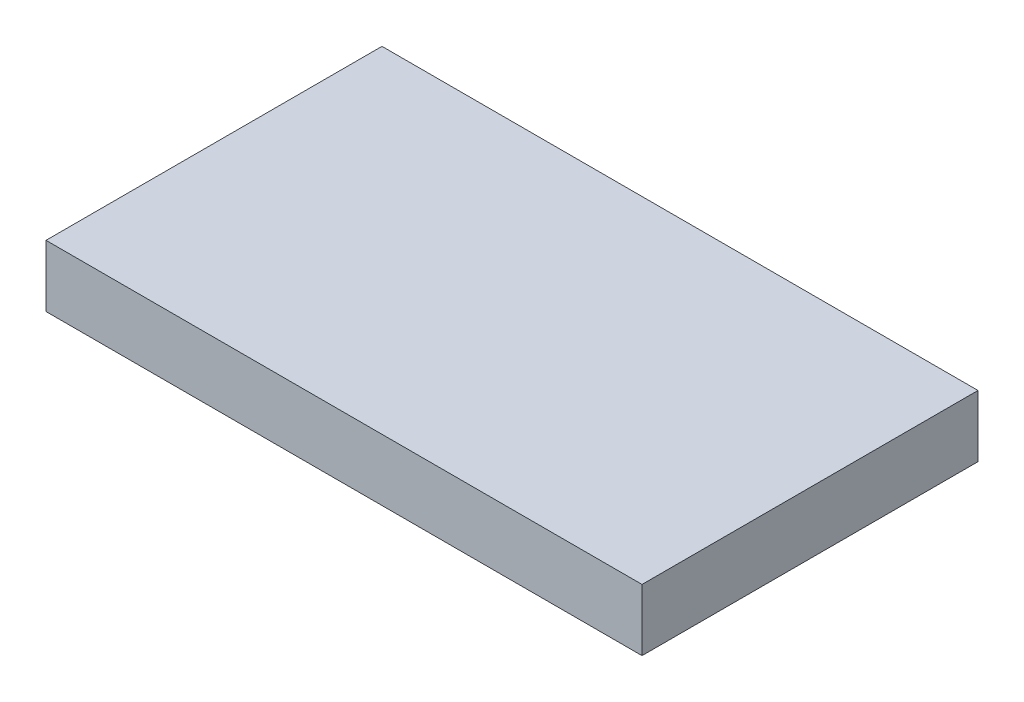
ISO-10303-21;
HEADER;
FILE_DESCRIPTION(('STEP AP214'),'2;1');
FILE_NAME('part.step','',(''),(''),'','','');
FILE_SCHEMA(('AUTOMOTIVE_DESIGN { 1 0 10303 214 1 1 1 1 }'));
ENDSEC;
DATA;
#1=APPLICATION_CONTEXT('core data for automotive mechanical design processes');
#2=APPLICATION_PROTOCOL_DEFINITION('international standard','automotive_design',2000,#1);
#3=PRODUCT_CONTEXT('',#1,'mechanical');
#4=PRODUCT('Part','Part','',(#3));
#5=PRODUCT_RELATED_PRODUCT_CATEGORY('part','',(#4));
#6=PRODUCT_DEFINITION_FORMATION('','',#4);
#7=PRODUCT_DEFINITION_CONTEXT('part definition',#1,'design');
#8=PRODUCT_DEFINITION('design','',#6,#7);
#9=PRODUCT_DEFINITION_SHAPE('','',#8);
#10=(LENGTH_UNIT() NAMED_UNIT(*) SI_UNIT(.MILLI.,.METRE.));
#11=(NAMED_UNIT(*) PLANE_ANGLE_UNIT() SI_UNIT($,.RADIAN.));
#12=(NAMED_UNIT(*) SI_UNIT($,.STERADIAN.) SOLID_ANGLE_UNIT());
#13=UNCERTAINTY_MEASURE_WITH_UNIT(LENGTH_MEASURE(1.E-05),#10,'distance_accuracy_value','');
#14=(GEOMETRIC_REPRESENTATION_CONTEXT(3) GLOBAL_UNCERTAINTY_ASSIGNED_CONTEXT((#13)) GLOBAL_UNIT_ASSIGNED_CONTEXT((#10,
#11,#12)) REPRESENTATION_CONTEXT('',''));
#15=CARTESIAN_POINT('',(0.,0.,0.));
#16=DIRECTION('',(0.,0.,1.));
#17=DIRECTION('',(1.,0.,0.));
#18=AXIS2_PLACEMENT_3D('',#15,#16,#17);
#19=CARTESIAN_POINT('',(0.,3.302,0.));
#20=DIRECTION('',(1.,0.,0.));
#21=DIRECTION('',(0.,0.,-1.));
#22=AXIS2_PLACEMENT_3D('',#19,#20,#21);
#23=PLANE('',#22);
#24=DIRECTION('',(0.,0.,1.));
#25=VECTOR('',#24,1.);
#26=CARTESIAN_POINT('',(0.,0.,0.));
#27=LINE('',#26,#25);
#28=CARTESIAN_POINT('',(0.,0.,-17.9832));
#29=VERTEX_POINT('',#28);
#30=CARTESIAN_POINT('',(0.,0.,0.));
#31=VERTEX_POINT('',#30);
#32=EDGE_CURVE('E99',#29,#31,#27,.T.);
#33=ORIENTED_EDGE('',*,*,#32,.T.);
#34=DIRECTION('',(0.,-1.,0.));
#35=VECTOR('',#34,1.);
#36=CARTESIAN_POINT('',(0.,3.302,0.));
#37=LINE('',#36,#35);
#38=CARTESIAN_POINT('',(0.,3.302,0.));
#39=VERTEX_POINT('',#38);
#40=EDGE_CURVE('E11',#39,#31,#37,.T.);
#41=ORIENTED_EDGE('',*,*,#40,.F.);
#42=DIRECTION('',(0.,0.,1.));
#43=VECTOR('',#42,1.);
#44=CARTESIAN_POINT('',(0.,3.302,0.));
#45=LINE('',#44,#43);
#46=CARTESIAN_POINT('',(0.,3.302,-17.9832));
#47=VERTEX_POINT('',#46);
#48=EDGE_CURVE('E87',#47,#39,#45,.T.);
#49=ORIENTED_EDGE('',*,*,#48,.F.);
#50=DIRECTION('',(0.,-1.,0.));
#51=VECTOR('',#50,1.);
#52=CARTESIAN_POINT('',(0.,3.302,-17.9832));
#53=LINE('',#52,#51);
#54=EDGE_CURVE('E95',#47,#29,#53,.T.);
#55=ORIENTED_EDGE('',*,*,#54,.T.);
#56=EDGE_LOOP('',(#33,#41,#49,#55));
#57=FACE_BOUND('',#56,.T.);
#58=ADVANCED_FACE('F36',(#57),#23,.F.);
#59=CARTESIAN_POINT('',(0.,3.302,0.));
#60=DIRECTION('',(0.,0.,-1.));
#61=DIRECTION('',(-1.,0.,0.));
#62=AXIS2_PLACEMENT_3D('',#59,#60,#61);
#63=PLANE('',#62);
#64=DIRECTION('',(1.,0.,0.));
#65=VECTOR('',#64,1.);
#66=CARTESIAN_POINT('',(0.,0.,0.));
#67=LINE('',#66,#65);
#68=CARTESIAN_POINT('',(31.9024,0.,0.));
#69=VERTEX_POINT('',#68);
#70=EDGE_CURVE('E91',#31,#69,#67,.T.);
#71=ORIENTED_EDGE('',*,*,#70,.T.);
#72=DIRECTION('',(0.,-1.,0.));
#73=VECTOR('',#72,1.);
#74=CARTESIAN_POINT('',(31.9024,3.302,0.));
#75=LINE('',#74,#73);
#76=CARTESIAN_POINT('',(31.9024,3.302,0.));
#77=VERTEX_POINT('',#76);
#78=EDGE_CURVE('E44',#77,#69,#75,.T.);
#79=ORIENTED_EDGE('',*,*,#78,.F.);
#80=DIRECTION('',(1.,0.,0.));
#81=VECTOR('',#80,1.);
#82=CARTESIAN_POINT('',(0.,3.302,0.));
#83=LINE('',#82,#81);
#84=EDGE_CURVE('E82',#39,#77,#83,.T.);
#85=ORIENTED_EDGE('',*,*,#84,.F.);
#86=ORIENTED_EDGE('',*,*,#40,.T.);
#87=EDGE_LOOP('',(#71,#79,#85,#86));
#88=FACE_BOUND('',#87,.T.);
#89=ADVANCED_FACE('F90',(#88),#63,.F.);
#90=CARTESIAN_POINT('',(31.9024,3.302,0.));
#91=DIRECTION('',(-1.,0.,0.));
#92=DIRECTION('',(0.,0.,1.));
#93=AXIS2_PLACEMENT_3D('',#90,#91,#92);
#94=PLANE('',#93);
#95=DIRECTION('',(0.,0.,-1.));
#96=VECTOR('',#95,1.);
#97=CARTESIAN_POINT('',(31.9024,0.,0.));
#98=LINE('',#97,#96);
#99=CARTESIAN_POINT('',(31.9024,0.,-17.9832));
#100=VERTEX_POINT('',#99);
#101=EDGE_CURVE('E69',#69,#100,#98,.T.);
#102=ORIENTED_EDGE('',*,*,#101,.T.);
#103=DIRECTION('',(0.,-1.,0.));
#104=VECTOR('',#103,1.);
#105=CARTESIAN_POINT('',(31.9024,3.302,-17.9832));
#106=LINE('',#105,#104);
#107=CARTESIAN_POINT('',(31.9024,3.302,-17.9832));
#108=VERTEX_POINT('',#107);
#109=EDGE_CURVE('E92',#108,#100,#106,.T.);
#110=ORIENTED_EDGE('',*,*,#109,.F.);
#111=DIRECTION('',(0.,0.,-1.));
#112=VECTOR('',#111,1.);
#113=CARTESIAN_POINT('',(31.9024,3.302,0.));
#114=LINE('',#113,#112);
#115=EDGE_CURVE('E85',#77,#108,#114,.T.);
#116=ORIENTED_EDGE('',*,*,#115,.F.);
#117=ORIENTED_EDGE('',*,*,#78,.T.);
#118=EDGE_LOOP('',(#102,#110,#116,#117));
#119=FACE_BOUND('',#118,.T.);
#120=ADVANCED_FACE('F93',(#119),#94,.F.);
#121=CARTESIAN_POINT('',(0.,3.302,-17.9832));
#122=DIRECTION('',(0.,0.,1.));
#123=DIRECTION('',(1.,0.,0.));
#124=AXIS2_PLACEMENT_3D('',#121,#122,#123);
#125=PLANE('',#124);
#126=DIRECTION('',(-1.,0.,0.));
#127=VECTOR('',#126,1.);
#128=CARTESIAN_POINT('',(0.,0.,-17.9832));
#129=LINE('',#128,#127);
#130=EDGE_CURVE('E75',#100,#29,#129,.T.);
#131=ORIENTED_EDGE('',*,*,#130,.T.);
#132=ORIENTED_EDGE('',*,*,#54,.F.);
#133=DIRECTION('',(-1.,0.,0.));
#134=VECTOR('',#133,1.);
#135=CARTESIAN_POINT('',(0.,3.302,-17.9832));
#136=LINE('',#135,#134);
#137=EDGE_CURVE('E52',#108,#47,#136,.T.);
#138=ORIENTED_EDGE('',*,*,#137,.F.);
#139=ORIENTED_EDGE('',*,*,#109,.T.);
#140=EDGE_LOOP('',(#131,#132,#138,#139));
#141=FACE_BOUND('',#140,.T.);
#142=ADVANCED_FACE('F106',(#141),#125,.F.);
#143=CARTESIAN_POINT('',(0.,3.302,0.));
#144=DIRECTION('',(0.,-1.,0.));
#145=DIRECTION('',(0.,0.,-1.));
#146=AXIS2_PLACEMENT_3D('',#143,#144,#145);
#147=PLANE('',#146);
#148=ORIENTED_EDGE('',*,*,#48,.T.);
#149=ORIENTED_EDGE('',*,*,#84,.T.);
#150=ORIENTED_EDGE('',*,*,#115,.T.);
#151=ORIENTED_EDGE('',*,*,#137,.T.);
#152=EDGE_LOOP('',(#148,#149,#150,#151));
#153=FACE_BOUND('',#152,.T.);
#154=ADVANCED_FACE('F83',(#153),#147,.F.);
#155=CARTESIAN_POINT('',(0.,0.,0.));
#156=DIRECTION('',(0.,-1.,0.));
#157=DIRECTION('',(0.,0.,-1.));
#158=AXIS2_PLACEMENT_3D('',#155,#156,#157);
#159=PLANE('',#158);
#160=ORIENTED_EDGE('',*,*,#32,.F.);
#161=ORIENTED_EDGE('',*,*,#130,.F.);
#162=ORIENTED_EDGE('',*,*,#101,.F.);
#163=ORIENTED_EDGE('',*,*,#70,.F.);
#164=EDGE_LOOP('',(#160,#161,#162,#163));
#165=FACE_BOUND('',#164,.T.);
#166=ADVANCED_FACE('F109',(#165),#159,.T.);
#167=CLOSED_SHELL('',(#58,#89,#120,#142,#154,#166));
#168=MANIFOLD_SOLID_BREP('B2',#167);
#169=ADVANCED_BREP_SHAPE_REPRESENTATION('',(#18,#168),#14);
#170=SHAPE_DEFINITION_REPRESENTATION(#9,#169);
ENDSEC;
END-ISO-10303-21;
